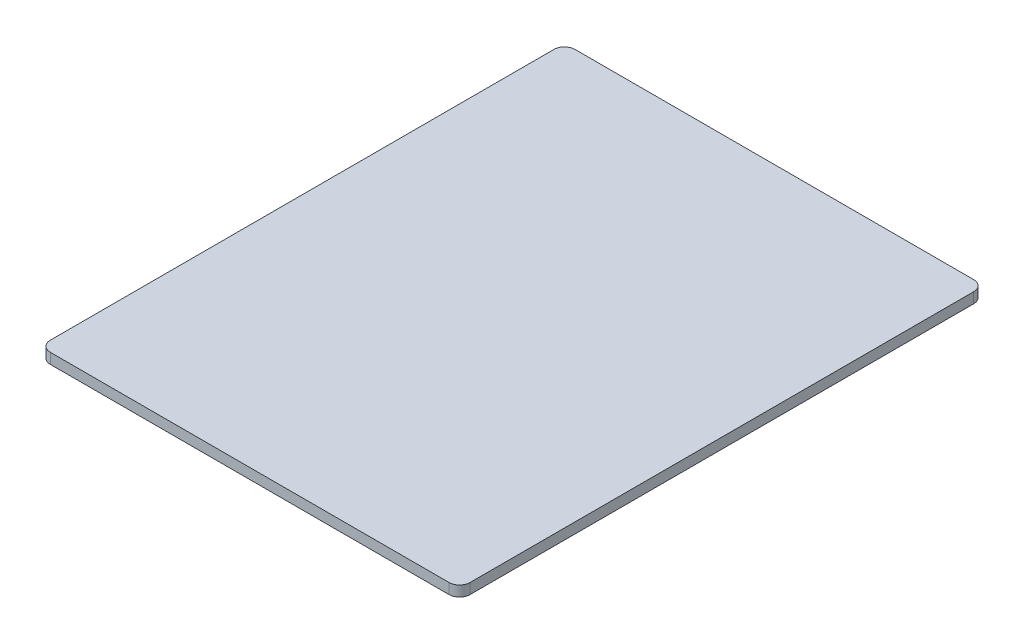
ISO-10303-21;
HEADER;
FILE_DESCRIPTION(('STEP AP214'),'2;1');
FILE_NAME('part.step','',(''),(''),'','','');
FILE_SCHEMA(('AUTOMOTIVE_DESIGN { 1 0 10303 214 1 1 1 1 }'));
ENDSEC;
DATA;
#1=APPLICATION_CONTEXT('core data for automotive mechanical design processes');
#2=APPLICATION_PROTOCOL_DEFINITION('international standard','automotive_design',2000,#1);
#3=PRODUCT_CONTEXT('',#1,'mechanical');
#4=PRODUCT('Part','Part','',(#3));
#5=PRODUCT_RELATED_PRODUCT_CATEGORY('part','',(#4));
#6=PRODUCT_DEFINITION_FORMATION('','',#4);
#7=PRODUCT_DEFINITION_CONTEXT('part definition',#1,'design');
#8=PRODUCT_DEFINITION('design','',#6,#7);
#9=PRODUCT_DEFINITION_SHAPE('','',#8);
#10=(LENGTH_UNIT() NAMED_UNIT(*) SI_UNIT(.MILLI.,.METRE.));
#11=(NAMED_UNIT(*) PLANE_ANGLE_UNIT() SI_UNIT($,.RADIAN.));
#12=(NAMED_UNIT(*) SI_UNIT($,.STERADIAN.) SOLID_ANGLE_UNIT());
#13=UNCERTAINTY_MEASURE_WITH_UNIT(LENGTH_MEASURE(1.E-05),#10,'distance_accuracy_value','');
#14=(GEOMETRIC_REPRESENTATION_CONTEXT(3) GLOBAL_UNCERTAINTY_ASSIGNED_CONTEXT((#13)) GLOBAL_UNIT_ASSIGNED_CONTEXT((#10,
#11,#12)) REPRESENTATION_CONTEXT('',''));
#15=CARTESIAN_POINT('',(0.,0.,0.));
#16=DIRECTION('',(0.,0.,1.));
#17=DIRECTION('',(1.,0.,0.));
#18=AXIS2_PLACEMENT_3D('',#15,#16,#17);
#19=CARTESIAN_POINT('',(0.,10.,0.));
#20=DIRECTION('',(1.,0.,0.));
#21=DIRECTION('',(0.,0.,-1.));
#22=AXIS2_PLACEMENT_3D('',#19,#20,#21);
#23=PLANE('',#22);
#24=DIRECTION('',(0.,0.,1.));
#25=VECTOR('',#24,1.);
#26=CARTESIAN_POINT('',(0.,10.,0.));
#27=LINE('',#26,#25);
#28=CARTESIAN_POINT('',(0.,10.,-490.));
#29=VERTEX_POINT('',#28);
#30=CARTESIAN_POINT('',(0.,10.,-10.));
#31=VERTEX_POINT('',#30);
#32=EDGE_CURVE('E121',#29,#31,#27,.T.);
#33=ORIENTED_EDGE('',*,*,#32,.F.);
#34=DIRECTION('',(0.,-1.,0.));
#35=VECTOR('',#34,1.);
#36=CARTESIAN_POINT('',(0.,10.,-490.));
#37=LINE('',#36,#35);
#38=CARTESIAN_POINT('',(0.,0.,-490.));
#39=VERTEX_POINT('',#38);
#40=EDGE_CURVE('E109',#29,#39,#37,.T.);
#41=ORIENTED_EDGE('',*,*,#40,.T.);
#42=DIRECTION('',(0.,0.,1.));
#43=VECTOR('',#42,1.);
#44=CARTESIAN_POINT('',(0.,0.,0.));
#45=LINE('',#44,#43);
#46=CARTESIAN_POINT('',(0.,0.,-10.));
#47=VERTEX_POINT('',#46);
#48=EDGE_CURVE('E125',#39,#47,#45,.T.);
#49=ORIENTED_EDGE('',*,*,#48,.T.);
#50=DIRECTION('',(0.,-1.,0.));
#51=VECTOR('',#50,1.);
#52=CARTESIAN_POINT('',(0.,10.,-10.));
#53=LINE('',#52,#51);
#54=EDGE_CURVE('E130',#47,#31,#53,.F.);
#55=ORIENTED_EDGE('',*,*,#54,.T.);
#56=EDGE_LOOP('',(#33,#41,#49,#55));
#57=FACE_BOUND('',#56,.T.);
#58=ADVANCED_FACE('F39',(#57),#23,.F.);
#59=CARTESIAN_POINT('',(0.,10.,0.));
#60=DIRECTION('',(0.,0.,-1.));
#61=DIRECTION('',(-1.,0.,0.));
#62=AXIS2_PLACEMENT_3D('',#59,#60,#61);
#63=PLANE('',#62);
#64=DIRECTION('',(1.,0.,0.));
#65=VECTOR('',#64,1.);
#66=CARTESIAN_POINT('',(0.,10.,0.));
#67=LINE('',#66,#65);
#68=CARTESIAN_POINT('',(10.,10.,0.));
#69=VERTEX_POINT('',#68);
#70=CARTESIAN_POINT('',(390.,10.,0.));
#71=VERTEX_POINT('',#70);
#72=EDGE_CURVE('E164',#69,#71,#67,.T.);
#73=ORIENTED_EDGE('',*,*,#72,.F.);
#74=DIRECTION('',(0.,-1.,0.));
#75=VECTOR('',#74,1.);
#76=CARTESIAN_POINT('',(10.,10.,0.));
#77=LINE('',#76,#75);
#78=CARTESIAN_POINT('',(10.,0.,0.));
#79=VERTEX_POINT('',#78);
#80=EDGE_CURVE('E11',#69,#79,#77,.T.);
#81=ORIENTED_EDGE('',*,*,#80,.T.);
#82=DIRECTION('',(1.,0.,0.));
#83=VECTOR('',#82,1.);
#84=CARTESIAN_POINT('',(0.,0.,0.));
#85=LINE('',#84,#83);
#86=CARTESIAN_POINT('',(390.,0.,0.));
#87=VERTEX_POINT('',#86);
#88=EDGE_CURVE('E135',#79,#87,#85,.T.);
#89=ORIENTED_EDGE('',*,*,#88,.T.);
#90=DIRECTION('',(0.,-1.,0.));
#91=VECTOR('',#90,1.);
#92=CARTESIAN_POINT('',(390.,10.,0.));
#93=LINE('',#92,#91);
#94=EDGE_CURVE('E50',#87,#71,#93,.F.);
#95=ORIENTED_EDGE('',*,*,#94,.T.);
#96=EDGE_LOOP('',(#73,#81,#89,#95));
#97=FACE_BOUND('',#96,.T.);
#98=ADVANCED_FACE('F163',(#97),#63,.F.);
#99=CARTESIAN_POINT('',(400.,10.,0.));
#100=DIRECTION('',(-1.,0.,0.));
#101=DIRECTION('',(0.,0.,1.));
#102=AXIS2_PLACEMENT_3D('',#99,#100,#101);
#103=PLANE('',#102);
#104=DIRECTION('',(0.,0.,-1.));
#105=VECTOR('',#104,1.);
#106=CARTESIAN_POINT('',(400.,0.,0.));
#107=LINE('',#106,#105);
#108=CARTESIAN_POINT('',(400.,0.,-10.));
#109=VERTEX_POINT('',#108);
#110=CARTESIAN_POINT('',(400.,0.,-490.));
#111=VERTEX_POINT('',#110);
#112=EDGE_CURVE('E133',#109,#111,#107,.T.);
#113=ORIENTED_EDGE('',*,*,#112,.T.);
#114=DIRECTION('',(0.,-1.,0.));
#115=VECTOR('',#114,1.);
#116=CARTESIAN_POINT('',(400.,10.,-490.));
#117=LINE('',#116,#115);
#118=CARTESIAN_POINT('',(400.,10.,-490.));
#119=VERTEX_POINT('',#118);
#120=EDGE_CURVE('E53',#111,#119,#117,.F.);
#121=ORIENTED_EDGE('',*,*,#120,.T.);
#122=DIRECTION('',(0.,0.,-1.));
#123=VECTOR('',#122,1.);
#124=CARTESIAN_POINT('',(400.,10.,0.));
#125=LINE('',#124,#123);
#126=CARTESIAN_POINT('',(400.,10.,-10.));
#127=VERTEX_POINT('',#126);
#128=EDGE_CURVE('E172',#127,#119,#125,.T.);
#129=ORIENTED_EDGE('',*,*,#128,.F.);
#130=DIRECTION('',(0.,-1.,0.));
#131=VECTOR('',#130,1.);
#132=CARTESIAN_POINT('',(400.,10.,-10.));
#133=LINE('',#132,#131);
#134=EDGE_CURVE('E158',#127,#109,#133,.T.);
#135=ORIENTED_EDGE('',*,*,#134,.T.);
#136=EDGE_LOOP('',(#113,#121,#129,#135));
#137=FACE_BOUND('',#136,.T.);
#138=ADVANCED_FACE('F173',(#137),#103,.F.);
#139=CARTESIAN_POINT('',(0.,10.,-500.));
#140=DIRECTION('',(0.,0.,1.));
#141=DIRECTION('',(1.,0.,0.));
#142=AXIS2_PLACEMENT_3D('',#139,#140,#141);
#143=PLANE('',#142);
#144=DIRECTION('',(-1.,0.,0.));
#145=VECTOR('',#144,1.);
#146=CARTESIAN_POINT('',(0.,0.,-500.));
#147=LINE('',#146,#145);
#148=CARTESIAN_POINT('',(390.,0.,-500.));
#149=VERTEX_POINT('',#148);
#150=CARTESIAN_POINT('',(10.,0.,-500.));
#151=VERTEX_POINT('',#150);
#152=EDGE_CURVE('E142',#149,#151,#147,.T.);
#153=ORIENTED_EDGE('',*,*,#152,.T.);
#154=DIRECTION('',(0.,-1.,0.));
#155=VECTOR('',#154,1.);
#156=CARTESIAN_POINT('',(10.,10.,-500.));
#157=LINE('',#156,#155);
#158=CARTESIAN_POINT('',(10.,10.,-500.));
#159=VERTEX_POINT('',#158);
#160=EDGE_CURVE('E112',#151,#159,#157,.F.);
#161=ORIENTED_EDGE('',*,*,#160,.T.);
#162=DIRECTION('',(-1.,0.,0.));
#163=VECTOR('',#162,1.);
#164=CARTESIAN_POINT('',(0.,10.,-500.));
#165=LINE('',#164,#163);
#166=CARTESIAN_POINT('',(390.,10.,-500.));
#167=VERTEX_POINT('',#166);
#168=EDGE_CURVE('E138',#167,#159,#165,.T.);
#169=ORIENTED_EDGE('',*,*,#168,.F.);
#170=DIRECTION('',(0.,-1.,0.));
#171=VECTOR('',#170,1.);
#172=CARTESIAN_POINT('',(390.,10.,-500.));
#173=LINE('',#172,#171);
#174=EDGE_CURVE('E117',#167,#149,#173,.T.);
#175=ORIENTED_EDGE('',*,*,#174,.T.);
#176=EDGE_LOOP('',(#153,#161,#169,#175));
#177=FACE_BOUND('',#176,.T.);
#178=ADVANCED_FACE('F185',(#177),#143,.F.);
#179=CARTESIAN_POINT('',(0.,10.,0.));
#180=DIRECTION('',(0.,-1.,0.));
#181=DIRECTION('',(0.,0.,-1.));
#182=AXIS2_PLACEMENT_3D('',#179,#180,#181);
#183=PLANE('',#182);
#184=ORIENTED_EDGE('',*,*,#168,.T.);
#185=CARTESIAN_POINT('',(10.,10.,-490.));
#186=DIRECTION('',(0.,-1.,0.));
#187=DIRECTION('',(0.,0.,-1.));
#188=AXIS2_PLACEMENT_3D('',#185,#186,#187);
#189=CIRCLE('',#188,10.);
#190=EDGE_CURVE('E156',#159,#29,#189,.F.);
#191=ORIENTED_EDGE('',*,*,#190,.T.);
#192=ORIENTED_EDGE('',*,*,#32,.T.);
#193=CARTESIAN_POINT('',(10.,10.,-10.));
#194=DIRECTION('',(0.,-1.,0.));
#195=DIRECTION('',(0.,0.,-1.));
#196=AXIS2_PLACEMENT_3D('',#193,#194,#195);
#197=CIRCLE('',#196,10.);
#198=EDGE_CURVE('E155',#31,#69,#197,.F.);
#199=ORIENTED_EDGE('',*,*,#198,.T.);
#200=ORIENTED_EDGE('',*,*,#72,.T.);
#201=CARTESIAN_POINT('',(390.,10.,-10.));
#202=DIRECTION('',(0.,-1.,0.));
#203=DIRECTION('',(0.,0.,-1.));
#204=AXIS2_PLACEMENT_3D('',#201,#202,#203);
#205=CIRCLE('',#204,10.);
#206=EDGE_CURVE('E62',#71,#127,#205,.F.);
#207=ORIENTED_EDGE('',*,*,#206,.T.);
#208=ORIENTED_EDGE('',*,*,#128,.T.);
#209=CARTESIAN_POINT('',(390.,10.,-490.));
#210=DIRECTION('',(0.,-1.,0.));
#211=DIRECTION('',(0.,0.,-1.));
#212=AXIS2_PLACEMENT_3D('',#209,#210,#211);
#213=CIRCLE('',#212,10.);
#214=EDGE_CURVE('E152',#119,#167,#213,.F.);
#215=ORIENTED_EDGE('',*,*,#214,.T.);
#216=EDGE_LOOP('',(#184,#191,#192,#199,#200,#207,#208,#215));
#217=FACE_BOUND('',#216,.T.);
#218=ADVANCED_FACE('F166',(#217),#183,.F.);
#219=CARTESIAN_POINT('',(0.,0.,0.));
#220=DIRECTION('',(0.,-1.,0.));
#221=DIRECTION('',(0.,0.,-1.));
#222=AXIS2_PLACEMENT_3D('',#219,#220,#221);
#223=PLANE('',#222);
#224=ORIENTED_EDGE('',*,*,#48,.F.);
#225=CARTESIAN_POINT('',(10.,0.,-490.));
#226=DIRECTION('',(0.,-1.,0.));
#227=DIRECTION('',(0.,0.,-1.));
#228=AXIS2_PLACEMENT_3D('',#225,#226,#227);
#229=CIRCLE('',#228,10.);
#230=EDGE_CURVE('E106',#39,#151,#229,.T.);
#231=ORIENTED_EDGE('',*,*,#230,.T.);
#232=ORIENTED_EDGE('',*,*,#152,.F.);
#233=CARTESIAN_POINT('',(390.,0.,-490.));
#234=DIRECTION('',(0.,-1.,0.));
#235=DIRECTION('',(0.,0.,-1.));
#236=AXIS2_PLACEMENT_3D('',#233,#234,#235);
#237=CIRCLE('',#236,10.);
#238=EDGE_CURVE('E120',#149,#111,#237,.T.);
#239=ORIENTED_EDGE('',*,*,#238,.T.);
#240=ORIENTED_EDGE('',*,*,#112,.F.);
#241=CARTESIAN_POINT('',(390.,0.,-10.));
#242=DIRECTION('',(0.,-1.,0.));
#243=DIRECTION('',(0.,0.,-1.));
#244=AXIS2_PLACEMENT_3D('',#241,#242,#243);
#245=CIRCLE('',#244,10.);
#246=EDGE_CURVE('E127',#109,#87,#245,.T.);
#247=ORIENTED_EDGE('',*,*,#246,.T.);
#248=ORIENTED_EDGE('',*,*,#88,.F.);
#249=CARTESIAN_POINT('',(10.,0.,-10.));
#250=DIRECTION('',(0.,-1.,0.));
#251=DIRECTION('',(0.,0.,-1.));
#252=AXIS2_PLACEMENT_3D('',#249,#250,#251);
#253=CIRCLE('',#252,10.);
#254=EDGE_CURVE('E132',#79,#47,#253,.T.);
#255=ORIENTED_EDGE('',*,*,#254,.T.);
#256=EDGE_LOOP('',(#224,#231,#232,#239,#240,#247,#248,#255));
#257=FACE_BOUND('',#256,.T.);
#258=ADVANCED_FACE('F129',(#257),#223,.T.);
#259=CARTESIAN_POINT('',(10.,10.,-490.));
#260=DIRECTION('',(0.,-1.,0.));
#261=DIRECTION('',(0.,0.,-1.));
#262=AXIS2_PLACEMENT_3D('',#259,#260,#261);
#263=CYLINDRICAL_SURFACE('',#262,10.);
#264=ORIENTED_EDGE('',*,*,#190,.F.);
#265=ORIENTED_EDGE('',*,*,#160,.F.);
#266=ORIENTED_EDGE('',*,*,#230,.F.);
#267=ORIENTED_EDGE('',*,*,#40,.F.);
#268=EDGE_LOOP('',(#264,#265,#266,#267));
#269=FACE_BOUND('',#268,.T.);
#270=ADVANCED_FACE('F108',(#269),#263,.T.);
#271=CARTESIAN_POINT('',(390.,10.,-490.));
#272=DIRECTION('',(0.,-1.,0.));
#273=DIRECTION('',(0.,0.,-1.));
#274=AXIS2_PLACEMENT_3D('',#271,#272,#273);
#275=CYLINDRICAL_SURFACE('',#274,10.);
#276=ORIENTED_EDGE('',*,*,#214,.F.);
#277=ORIENTED_EDGE('',*,*,#120,.F.);
#278=ORIENTED_EDGE('',*,*,#238,.F.);
#279=ORIENTED_EDGE('',*,*,#174,.F.);
#280=EDGE_LOOP('',(#276,#277,#278,#279));
#281=FACE_BOUND('',#280,.T.);
#282=ADVANCED_FACE('F179',(#281),#275,.T.);
#283=CARTESIAN_POINT('',(10.,10.,-10.));
#284=DIRECTION('',(0.,-1.,0.));
#285=DIRECTION('',(0.,0.,-1.));
#286=AXIS2_PLACEMENT_3D('',#283,#284,#285);
#287=CYLINDRICAL_SURFACE('',#286,10.);
#288=ORIENTED_EDGE('',*,*,#198,.F.);
#289=ORIENTED_EDGE('',*,*,#54,.F.);
#290=ORIENTED_EDGE('',*,*,#254,.F.);
#291=ORIENTED_EDGE('',*,*,#80,.F.);
#292=EDGE_LOOP('',(#288,#289,#290,#291));
#293=FACE_BOUND('',#292,.T.);
#294=ADVANCED_FACE('F183',(#293),#287,.T.);
#295=CARTESIAN_POINT('',(390.,10.,-10.));
#296=DIRECTION('',(0.,-1.,0.));
#297=DIRECTION('',(0.,0.,-1.));
#298=AXIS2_PLACEMENT_3D('',#295,#296,#297);
#299=CYLINDRICAL_SURFACE('',#298,10.);
#300=ORIENTED_EDGE('',*,*,#206,.F.);
#301=ORIENTED_EDGE('',*,*,#94,.F.);
#302=ORIENTED_EDGE('',*,*,#246,.F.);
#303=ORIENTED_EDGE('',*,*,#134,.F.);
#304=EDGE_LOOP('',(#300,#301,#302,#303));
#305=FACE_BOUND('',#304,.T.);
#306=ADVANCED_FACE('F41',(#305),#299,.T.);
#307=CLOSED_SHELL('',(#58,#98,#138,#178,#218,#258,#270,#282,#294,#306));
#308=MANIFOLD_SOLID_BREP('B2',#307);
#309=ADVANCED_BREP_SHAPE_REPRESENTATION('',(#18,#308),#14);
#310=SHAPE_DEFINITION_REPRESENTATION(#9,#309);
ENDSEC;
END-ISO-10303-21;
